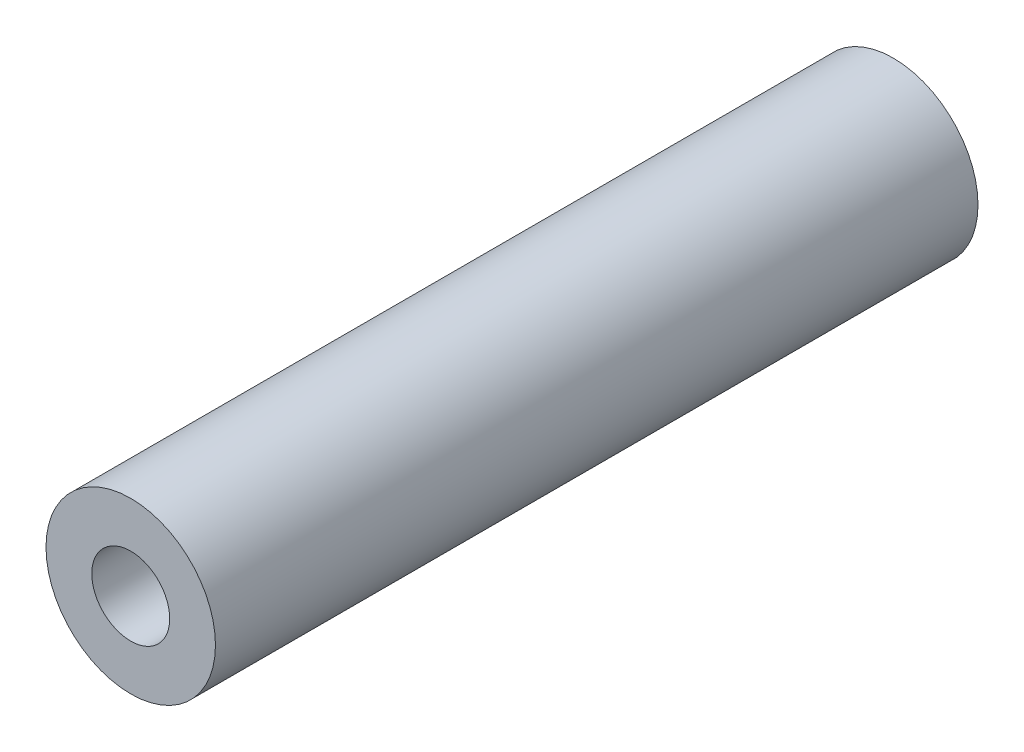
ISO-10303-21;
HEADER;
FILE_DESCRIPTION(('STEP AP214'),'2;1');
FILE_NAME('part.step','',(''),(''),'','','');
FILE_SCHEMA(('AUTOMOTIVE_DESIGN { 1 0 10303 214 1 1 1 1 }'));
ENDSEC;
DATA;
#1=APPLICATION_CONTEXT('core data for automotive mechanical design processes');
#2=APPLICATION_PROTOCOL_DEFINITION('international standard','automotive_design',2000,#1);
#3=PRODUCT_CONTEXT('',#1,'mechanical');
#4=PRODUCT('Part','Part','',(#3));
#5=PRODUCT_RELATED_PRODUCT_CATEGORY('part','',(#4));
#6=PRODUCT_DEFINITION_FORMATION('','',#4);
#7=PRODUCT_DEFINITION_CONTEXT('part definition',#1,'design');
#8=PRODUCT_DEFINITION('design','',#6,#7);
#9=PRODUCT_DEFINITION_SHAPE('','',#8);
#10=(LENGTH_UNIT() NAMED_UNIT(*) SI_UNIT(.MILLI.,.METRE.));
#11=(NAMED_UNIT(*) PLANE_ANGLE_UNIT() SI_UNIT($,.RADIAN.));
#12=(NAMED_UNIT(*) SI_UNIT($,.STERADIAN.) SOLID_ANGLE_UNIT());
#13=UNCERTAINTY_MEASURE_WITH_UNIT(LENGTH_MEASURE(1.E-05),#10,'distance_accuracy_value','');
#14=(GEOMETRIC_REPRESENTATION_CONTEXT(3) GLOBAL_UNCERTAINTY_ASSIGNED_CONTEXT((#13)) GLOBAL_UNIT_ASSIGNED_CONTEXT((#10,
#11,#12)) REPRESENTATION_CONTEXT('',''));
#15=CARTESIAN_POINT('',(0.,0.,0.));
#16=DIRECTION('',(0.,0.,1.));
#17=DIRECTION('',(1.,0.,0.));
#18=AXIS2_PLACEMENT_3D('',#15,#16,#17);
#19=CARTESIAN_POINT('',(0.,0.,14.2875));
#20=DIRECTION('',(0.,0.,1.));
#21=DIRECTION('',(1.,0.,0.));
#22=AXIS2_PLACEMENT_3D('',#19,#20,#21);
#23=PLANE('',#22);
#24=CARTESIAN_POINT('',(0.,0.,14.2875));
#25=DIRECTION('',(0.,0.,1.));
#26=DIRECTION('',(1.,0.,0.));
#27=AXIS2_PLACEMENT_3D('',#24,#25,#26);
#28=CIRCLE('',#27,3.175);
#29=CARTESIAN_POINT('',(3.175,0.,14.2875));
#30=VERTEX_POINT('',#29);
#31=EDGE_CURVE('E10',#30,#30,#28,.T.);
#32=ORIENTED_EDGE('',*,*,#31,.T.);
#33=EDGE_LOOP('',(#32));
#34=FACE_BOUND('',#33,.T.);
#35=CARTESIAN_POINT('',(0.,0.,14.2875));
#36=DIRECTION('',(0.,0.,1.));
#37=DIRECTION('',(1.,0.,0.));
#38=AXIS2_PLACEMENT_3D('',#35,#36,#37);
#39=CIRCLE('',#38,1.4605);
#40=CARTESIAN_POINT('',(1.4605,0.,14.2875));
#41=VERTEX_POINT('',#40);
#42=EDGE_CURVE('E42',#41,#41,#39,.T.);
#43=ORIENTED_EDGE('',*,*,#42,.F.);
#44=EDGE_LOOP('',(#43));
#45=FACE_BOUND('',#44,.T.);
#46=ADVANCED_FACE('F35',(#34,#45),#23,.T.);
#47=CARTESIAN_POINT('',(0.,0.,14.2875));
#48=DIRECTION('',(0.,0.,-1.));
#49=DIRECTION('',(-1.,0.,0.));
#50=AXIS2_PLACEMENT_3D('',#47,#48,#49);
#51=CYLINDRICAL_SURFACE('',#50,3.175);
#52=ORIENTED_EDGE('',*,*,#31,.F.);
#53=EDGE_LOOP('',(#52));
#54=FACE_BOUND('',#53,.T.);
#55=CARTESIAN_POINT('',(0.,0.,-14.2875));
#56=DIRECTION('',(0.,0.,1.));
#57=DIRECTION('',(1.,0.,0.));
#58=AXIS2_PLACEMENT_3D('',#55,#56,#57);
#59=CIRCLE('',#58,3.175);
#60=CARTESIAN_POINT('',(3.175,0.,-14.2875));
#61=VERTEX_POINT('',#60);
#62=EDGE_CURVE('E46',#61,#61,#59,.T.);
#63=ORIENTED_EDGE('',*,*,#62,.T.);
#64=EDGE_LOOP('',(#63));
#65=FACE_BOUND('',#64,.T.);
#66=ADVANCED_FACE('F37',(#54,#65),#51,.T.);
#67=CARTESIAN_POINT('',(0.,0.,14.2875));
#68=DIRECTION('',(0.,0.,-1.));
#69=DIRECTION('',(-1.,0.,0.));
#70=AXIS2_PLACEMENT_3D('',#67,#68,#69);
#71=CYLINDRICAL_SURFACE('',#70,1.4605);
#72=ORIENTED_EDGE('',*,*,#42,.T.);
#73=EDGE_LOOP('',(#72));
#74=FACE_BOUND('',#73,.T.);
#75=CARTESIAN_POINT('',(0.,0.,-14.2875));
#76=DIRECTION('',(0.,0.,1.));
#77=DIRECTION('',(1.,0.,0.));
#78=AXIS2_PLACEMENT_3D('',#75,#76,#77);
#79=CIRCLE('',#78,1.4605);
#80=CARTESIAN_POINT('',(1.4605,0.,-14.2875));
#81=VERTEX_POINT('',#80);
#82=EDGE_CURVE('E50',#81,#81,#79,.T.);
#83=ORIENTED_EDGE('',*,*,#82,.F.);
#84=EDGE_LOOP('',(#83));
#85=FACE_BOUND('',#84,.T.);
#86=ADVANCED_FACE('F59',(#74,#85),#71,.F.);
#87=CARTESIAN_POINT('',(0.,0.,-14.2875));
#88=DIRECTION('',(0.,0.,1.));
#89=DIRECTION('',(1.,0.,0.));
#90=AXIS2_PLACEMENT_3D('',#87,#88,#89);
#91=PLANE('',#90);
#92=ORIENTED_EDGE('',*,*,#82,.T.);
#93=EDGE_LOOP('',(#92));
#94=FACE_BOUND('',#93,.T.);
#95=ORIENTED_EDGE('',*,*,#62,.F.);
#96=EDGE_LOOP('',(#95));
#97=FACE_BOUND('',#96,.T.);
#98=ADVANCED_FACE('F56',(#94,#97),#91,.F.);
#99=CLOSED_SHELL('',(#46,#66,#86,#98));
#100=MANIFOLD_SOLID_BREP('B2',#99);
#101=ADVANCED_BREP_SHAPE_REPRESENTATION('',(#18,#100),#14);
#102=SHAPE_DEFINITION_REPRESENTATION(#9,#101);
ENDSEC;
END-ISO-10303-21;
